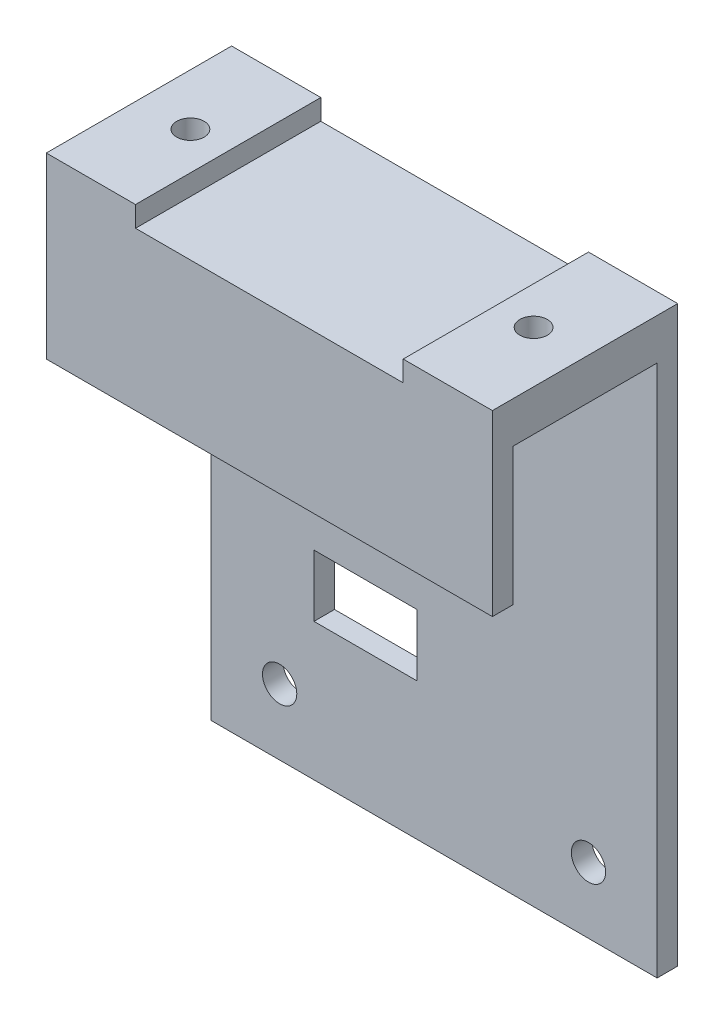
ISO-10303-21;
HEADER;
FILE_DESCRIPTION(('STEP AP214'),'2;1');
FILE_NAME('part.step','',(''),(''),'','','');
FILE_SCHEMA(('AUTOMOTIVE_DESIGN { 1 0 10303 214 1 1 1 1 }'));
ENDSEC;
DATA;
#1=APPLICATION_CONTEXT('core data for automotive mechanical design processes');
#2=APPLICATION_PROTOCOL_DEFINITION('international standard','automotive_design',2000,#1);
#3=PRODUCT_CONTEXT('',#1,'mechanical');
#4=PRODUCT('Part','Part','',(#3));
#5=PRODUCT_RELATED_PRODUCT_CATEGORY('part','',(#4));
#6=PRODUCT_DEFINITION_FORMATION('','',#4);
#7=PRODUCT_DEFINITION_CONTEXT('part definition',#1,'design');
#8=PRODUCT_DEFINITION('design','',#6,#7);
#9=PRODUCT_DEFINITION_SHAPE('','',#8);
#10=(LENGTH_UNIT() NAMED_UNIT(*) SI_UNIT(.MILLI.,.METRE.));
#11=(NAMED_UNIT(*) PLANE_ANGLE_UNIT() SI_UNIT($,.RADIAN.));
#12=(NAMED_UNIT(*) SI_UNIT($,.STERADIAN.) SOLID_ANGLE_UNIT());
#13=UNCERTAINTY_MEASURE_WITH_UNIT(LENGTH_MEASURE(1.E-05),#10,'distance_accuracy_value','');
#14=(GEOMETRIC_REPRESENTATION_CONTEXT(3) GLOBAL_UNCERTAINTY_ASSIGNED_CONTEXT((#13)) GLOBAL_UNIT_ASSIGNED_CONTEXT((#10,
#11,#12)) REPRESENTATION_CONTEXT('',''));
#15=CARTESIAN_POINT('',(0.,0.,0.));
#16=DIRECTION('',(0.,0.,1.));
#17=DIRECTION('',(1.,0.,0.));
#18=AXIS2_PLACEMENT_3D('',#15,#16,#17);
#19=CARTESIAN_POINT('',(-32.5,35.,3.));
#20=DIRECTION('',(0.,-1.,0.));
#21=DIRECTION('',(0.,0.,-1.));
#22=AXIS2_PLACEMENT_3D('',#19,#20,#21);
#23=PLANE('',#22);
#24=CARTESIAN_POINT('',(-25.,35.,13.5));
#25=DIRECTION('',(0.,1.,0.));
#26=DIRECTION('',(0.,0.,1.));
#27=AXIS2_PLACEMENT_3D('',#24,#25,#26);
#28=CIRCLE('',#27,2.);
#29=CARTESIAN_POINT('',(-25.,35.,15.5));
#30=VERTEX_POINT('',#29);
#31=EDGE_CURVE('E248',#30,#30,#28,.T.);
#32=ORIENTED_EDGE('',*,*,#31,.F.);
#33=EDGE_LOOP('',(#32));
#34=FACE_BOUND('',#33,.T.);
#35=DIRECTION('',(1.,0.,0.));
#36=VECTOR('',#35,1.);
#37=CARTESIAN_POINT('',(-32.5,35.,27.));
#38=LINE('',#37,#36);
#39=CARTESIAN_POINT('',(-32.5,35.,27.));
#40=VERTEX_POINT('',#39);
#41=CARTESIAN_POINT('',(-19.5,35.,27.));
#42=VERTEX_POINT('',#41);
#43=EDGE_CURVE('E298',#40,#42,#38,.T.);
#44=ORIENTED_EDGE('',*,*,#43,.T.);
#45=DIRECTION('',(0.,0.,1.));
#46=VECTOR('',#45,1.);
#47=CARTESIAN_POINT('',(-19.5,35.,0.));
#48=LINE('',#47,#46);
#49=CARTESIAN_POINT('',(-19.5,35.,0.));
#50=VERTEX_POINT('',#49);
#51=EDGE_CURVE('E279',#50,#42,#48,.T.);
#52=ORIENTED_EDGE('',*,*,#51,.F.);
#53=DIRECTION('',(-1.,0.,0.));
#54=VECTOR('',#53,1.);
#55=CARTESIAN_POINT('',(-32.5,35.,0.));
#56=LINE('',#55,#54);
#57=CARTESIAN_POINT('',(-32.5,35.,0.));
#58=VERTEX_POINT('',#57);
#59=EDGE_CURVE('E356',#50,#58,#56,.T.);
#60=ORIENTED_EDGE('',*,*,#59,.T.);
#61=DIRECTION('',(0.,0.,-1.));
#62=VECTOR('',#61,1.);
#63=CARTESIAN_POINT('',(-32.5,35.,3.));
#64=LINE('',#63,#62);
#65=EDGE_CURVE('E61',#40,#58,#64,.T.);
#66=ORIENTED_EDGE('',*,*,#65,.F.);
#67=EDGE_LOOP('',(#44,#52,#60,#66));
#68=FACE_BOUND('',#67,.T.);
#69=ADVANCED_FACE('F51',(#34,#68),#23,.F.);
#70=CARTESIAN_POINT('',(0.,0.,3.));
#71=DIRECTION('',(0.,0.,-1.));
#72=DIRECTION('',(-1.,0.,0.));
#73=AXIS2_PLACEMENT_3D('',#70,#71,#72);
#74=PLANE('',#73);
#75=DIRECTION('',(-1.,0.,0.));
#76=VECTOR('',#75,1.);
#77=CARTESIAN_POINT('',(-17.5,-19.6,3.));
#78=LINE('',#77,#76);
#79=CARTESIAN_POINT('',(-2.5,-19.6,3.));
#80=VERTEX_POINT('',#79);
#81=CARTESIAN_POINT('',(-17.5,-19.6,3.));
#82=VERTEX_POINT('',#81);
#83=EDGE_CURVE('E201',#80,#82,#78,.T.);
#84=ORIENTED_EDGE('',*,*,#83,.F.);
#85=DIRECTION('',(0.,1.,0.));
#86=VECTOR('',#85,1.);
#87=CARTESIAN_POINT('',(-2.5,-19.6,3.));
#88=LINE('',#87,#86);
#89=CARTESIAN_POINT('',(-2.5,-28.6,3.));
#90=VERTEX_POINT('',#89);
#91=EDGE_CURVE('E69',#90,#80,#88,.T.);
#92=ORIENTED_EDGE('',*,*,#91,.F.);
#93=DIRECTION('',(1.,0.,0.));
#94=VECTOR('',#93,1.);
#95=CARTESIAN_POINT('',(-17.5,-28.6,3.));
#96=LINE('',#95,#94);
#97=CARTESIAN_POINT('',(-17.5,-28.6,3.));
#98=VERTEX_POINT('',#97);
#99=EDGE_CURVE('E188',#98,#90,#96,.T.);
#100=ORIENTED_EDGE('',*,*,#99,.F.);
#101=DIRECTION('',(0.,-1.,0.));
#102=VECTOR('',#101,1.);
#103=CARTESIAN_POINT('',(-17.5,-19.6,3.));
#104=LINE('',#103,#102);
#105=EDGE_CURVE('E192',#82,#98,#104,.T.);
#106=ORIENTED_EDGE('',*,*,#105,.F.);
#107=EDGE_LOOP('',(#84,#92,#100,#106));
#108=FACE_BOUND('',#107,.T.);
#109=CARTESIAN_POINT('',(-22.5,-39.,3.));
#110=DIRECTION('',(0.,0.,1.));
#111=DIRECTION('',(1.,0.,0.));
#112=AXIS2_PLACEMENT_3D('',#109,#110,#111);
#113=CIRCLE('',#112,2.5);
#114=CARTESIAN_POINT('',(-20.,-39.,3.));
#115=VERTEX_POINT('',#114);
#116=EDGE_CURVE('E221',#115,#115,#113,.T.);
#117=ORIENTED_EDGE('',*,*,#116,.F.);
#118=EDGE_LOOP('',(#117));
#119=FACE_BOUND('',#118,.T.);
#120=CARTESIAN_POINT('',(22.5,-39.,3.));
#121=DIRECTION('',(0.,0.,1.));
#122=DIRECTION('',(1.,0.,0.));
#123=AXIS2_PLACEMENT_3D('',#120,#121,#122);
#124=CIRCLE('',#123,2.5);
#125=CARTESIAN_POINT('',(25.,-39.,3.));
#126=VERTEX_POINT('',#125);
#127=EDGE_CURVE('E225',#126,#126,#124,.T.);
#128=ORIENTED_EDGE('',*,*,#127,.F.);
#129=EDGE_LOOP('',(#128));
#130=FACE_BOUND('',#129,.T.);
#131=DIRECTION('',(1.,0.,0.));
#132=VECTOR('',#131,1.);
#133=CARTESIAN_POINT('',(-32.5,29.,3.));
#134=LINE('',#133,#132);
#135=CARTESIAN_POINT('',(-32.5,29.,3.));
#136=VERTEX_POINT('',#135);
#137=CARTESIAN_POINT('',(32.5,29.,3.));
#138=VERTEX_POINT('',#137);
#139=EDGE_CURVE('E318',#136,#138,#134,.T.);
#140=ORIENTED_EDGE('',*,*,#139,.F.);
#141=DIRECTION('',(0.,-1.,0.));
#142=VECTOR('',#141,1.);
#143=CARTESIAN_POINT('',(-32.5,-35.,3.));
#144=LINE('',#143,#142);
#145=CARTESIAN_POINT('',(-32.5,-48.6,3.));
#146=VERTEX_POINT('',#145);
#147=EDGE_CURVE('E349',#136,#146,#144,.T.);
#148=ORIENTED_EDGE('',*,*,#147,.T.);
#149=DIRECTION('',(-1.,0.,0.));
#150=VECTOR('',#149,1.);
#151=CARTESIAN_POINT('',(32.5,-48.6,3.));
#152=LINE('',#151,#150);
#153=CARTESIAN_POINT('',(32.5,-48.6,3.));
#154=VERTEX_POINT('',#153);
#155=EDGE_CURVE('E243',#154,#146,#152,.T.);
#156=ORIENTED_EDGE('',*,*,#155,.F.);
#157=DIRECTION('',(0.,1.,0.));
#158=VECTOR('',#157,1.);
#159=CARTESIAN_POINT('',(32.5,-35.,3.));
#160=LINE('',#159,#158);
#161=EDGE_CURVE('E346',#154,#138,#160,.T.);
#162=ORIENTED_EDGE('',*,*,#161,.T.);
#163=EDGE_LOOP('',(#140,#148,#156,#162));
#164=FACE_BOUND('',#163,.T.);
#165=ADVANCED_FACE('F392',(#108,#119,#130,#164),#74,.F.);
#166=CARTESIAN_POINT('',(32.5,-35.,3.));
#167=DIRECTION('',(-1.,0.,0.));
#168=DIRECTION('',(0.,0.,1.));
#169=AXIS2_PLACEMENT_3D('',#166,#167,#168);
#170=PLANE('',#169);
#171=DIRECTION('',(0.,1.,0.));
#172=VECTOR('',#171,1.);
#173=CARTESIAN_POINT('',(32.5,-35.,0.));
#174=LINE('',#173,#172);
#175=CARTESIAN_POINT('',(32.5,-48.6,0.));
#176=VERTEX_POINT('',#175);
#177=CARTESIAN_POINT('',(32.5,35.,0.));
#178=VERTEX_POINT('',#177);
#179=EDGE_CURVE('E345',#176,#178,#174,.T.);
#180=ORIENTED_EDGE('',*,*,#179,.T.);
#181=DIRECTION('',(0.,0.,-1.));
#182=VECTOR('',#181,1.);
#183=CARTESIAN_POINT('',(32.5,35.,3.));
#184=LINE('',#183,#182);
#185=CARTESIAN_POINT('',(32.5,35.,27.));
#186=VERTEX_POINT('',#185);
#187=EDGE_CURVE('E12',#186,#178,#184,.T.);
#188=ORIENTED_EDGE('',*,*,#187,.F.);
#189=DIRECTION('',(0.,1.,0.));
#190=VECTOR('',#189,1.);
#191=CARTESIAN_POINT('',(32.5,9.00000000000001,27.));
#192=LINE('',#191,#190);
#193=CARTESIAN_POINT('',(32.5,9.00000000000001,27.));
#194=VERTEX_POINT('',#193);
#195=EDGE_CURVE('E323',#194,#186,#192,.T.);
#196=ORIENTED_EDGE('',*,*,#195,.F.);
#197=DIRECTION('',(0.,0.,-1.));
#198=VECTOR('',#197,1.);
#199=CARTESIAN_POINT('',(32.5,9.00000000000001,24.));
#200=LINE('',#199,#198);
#201=CARTESIAN_POINT('',(32.5,9.00000000000001,24.));
#202=VERTEX_POINT('',#201);
#203=EDGE_CURVE('E302',#194,#202,#200,.T.);
#204=ORIENTED_EDGE('',*,*,#203,.T.);
#205=DIRECTION('',(0.,1.,0.));
#206=VECTOR('',#205,1.);
#207=CARTESIAN_POINT('',(32.5,9.00000000000001,24.));
#208=LINE('',#207,#206);
#209=CARTESIAN_POINT('',(32.5,29.,24.));
#210=VERTEX_POINT('',#209);
#211=EDGE_CURVE('E319',#202,#210,#208,.T.);
#212=ORIENTED_EDGE('',*,*,#211,.T.);
#213=DIRECTION('',(0.,0.,-1.));
#214=VECTOR('',#213,1.);
#215=CARTESIAN_POINT('',(32.5,29.,24.));
#216=LINE('',#215,#214);
#217=EDGE_CURVE('E334',#210,#138,#216,.T.);
#218=ORIENTED_EDGE('',*,*,#217,.T.);
#219=ORIENTED_EDGE('',*,*,#161,.F.);
#220=DIRECTION('',(0.,0.,1.));
#221=VECTOR('',#220,1.);
#222=CARTESIAN_POINT('',(32.5,-48.6,0.));
#223=LINE('',#222,#221);
#224=EDGE_CURVE('E239',#176,#154,#223,.T.);
#225=ORIENTED_EDGE('',*,*,#224,.F.);
#226=EDGE_LOOP('',(#180,#188,#196,#204,#212,#218,#219,#225));
#227=FACE_BOUND('',#226,.T.);
#228=ADVANCED_FACE('F53',(#227),#170,.F.);
#229=CARTESIAN_POINT('',(25.,35.,13.5));
#230=DIRECTION('',(0.,1.,0.));
#231=DIRECTION('',(0.,0.,1.));
#232=AXIS2_PLACEMENT_3D('',#229,#230,#231);
#233=CIRCLE('',#232,2.);
#234=CARTESIAN_POINT('',(25.,35.,15.5));
#235=VERTEX_POINT('',#234);
#236=EDGE_CURVE('E247',#235,#235,#233,.T.);
#237=ORIENTED_EDGE('',*,*,#236,.F.);
#238=EDGE_LOOP('',(#237));
#239=FACE_BOUND('',#238,.T.);
#240=CARTESIAN_POINT('',(19.5,35.,0.));
#241=VERTEX_POINT('',#240);
#242=EDGE_CURVE('E357',#178,#241,#56,.T.);
#243=ORIENTED_EDGE('',*,*,#242,.T.);
#244=DIRECTION('',(0.,0.,1.));
#245=VECTOR('',#244,1.);
#246=CARTESIAN_POINT('',(19.5,35.,0.));
#247=LINE('',#246,#245);
#248=CARTESIAN_POINT('',(19.5,35.,27.));
#249=VERTEX_POINT('',#248);
#250=EDGE_CURVE('E283',#241,#249,#247,.T.);
#251=ORIENTED_EDGE('',*,*,#250,.T.);
#252=EDGE_CURVE('E282',#249,#186,#38,.T.);
#253=ORIENTED_EDGE('',*,*,#252,.T.);
#254=ORIENTED_EDGE('',*,*,#187,.T.);
#255=EDGE_LOOP('',(#243,#251,#253,#254));
#256=FACE_BOUND('',#255,.T.);
#257=ADVANCED_FACE('F394',(#239,#256),#23,.F.);
#258=CARTESIAN_POINT('',(-32.5,-35.,3.));
#259=DIRECTION('',(1.,0.,0.));
#260=DIRECTION('',(0.,0.,-1.));
#261=AXIS2_PLACEMENT_3D('',#258,#259,#260);
#262=PLANE('',#261);
#263=DIRECTION('',(0.,-1.,0.));
#264=VECTOR('',#263,1.);
#265=CARTESIAN_POINT('',(-32.5,-35.,0.));
#266=LINE('',#265,#264);
#267=CARTESIAN_POINT('',(-32.5,-48.6,0.));
#268=VERTEX_POINT('',#267);
#269=EDGE_CURVE('E350',#58,#268,#266,.T.);
#270=ORIENTED_EDGE('',*,*,#269,.T.);
#271=DIRECTION('',(0.,0.,-1.));
#272=VECTOR('',#271,1.);
#273=CARTESIAN_POINT('',(-32.5,-48.6,3.));
#274=LINE('',#273,#272);
#275=EDGE_CURVE('E220',#146,#268,#274,.T.);
#276=ORIENTED_EDGE('',*,*,#275,.F.);
#277=ORIENTED_EDGE('',*,*,#147,.F.);
#278=DIRECTION('',(0.,0.,-1.));
#279=VECTOR('',#278,1.);
#280=CARTESIAN_POINT('',(-32.5,29.,24.));
#281=LINE('',#280,#279);
#282=CARTESIAN_POINT('',(-32.5,29.,24.));
#283=VERTEX_POINT('',#282);
#284=EDGE_CURVE('E341',#283,#136,#281,.T.);
#285=ORIENTED_EDGE('',*,*,#284,.F.);
#286=DIRECTION('',(0.,1.,0.));
#287=VECTOR('',#286,1.);
#288=CARTESIAN_POINT('',(-32.5,9.00000000000001,24.));
#289=LINE('',#288,#287);
#290=CARTESIAN_POINT('',(-32.5,9.00000000000001,24.));
#291=VERTEX_POINT('',#290);
#292=EDGE_CURVE('E314',#291,#283,#289,.T.);
#293=ORIENTED_EDGE('',*,*,#292,.F.);
#294=DIRECTION('',(0.,0.,1.));
#295=VECTOR('',#294,1.);
#296=CARTESIAN_POINT('',(-32.5,9.00000000000001,24.));
#297=LINE('',#296,#295);
#298=CARTESIAN_POINT('',(-32.5,9.00000000000001,27.));
#299=VERTEX_POINT('',#298);
#300=EDGE_CURVE('E293',#291,#299,#297,.T.);
#301=ORIENTED_EDGE('',*,*,#300,.T.);
#302=DIRECTION('',(0.,1.,0.));
#303=VECTOR('',#302,1.);
#304=CARTESIAN_POINT('',(-32.5,9.00000000000001,27.));
#305=LINE('',#304,#303);
#306=EDGE_CURVE('E310',#299,#40,#305,.T.);
#307=ORIENTED_EDGE('',*,*,#306,.T.);
#308=ORIENTED_EDGE('',*,*,#65,.T.);
#309=EDGE_LOOP('',(#270,#276,#277,#285,#293,#301,#307,#308));
#310=FACE_BOUND('',#309,.T.);
#311=ADVANCED_FACE('F404',(#310),#262,.F.);
#312=CARTESIAN_POINT('',(0.,0.,0.));
#313=DIRECTION('',(0.,0.,-1.));
#314=DIRECTION('',(-1.,0.,0.));
#315=AXIS2_PLACEMENT_3D('',#312,#313,#314);
#316=PLANE('',#315);
#317=DIRECTION('',(0.,1.,0.));
#318=VECTOR('',#317,1.);
#319=CARTESIAN_POINT('',(-2.5,-19.6,0.));
#320=LINE('',#319,#318);
#321=CARTESIAN_POINT('',(-2.5,-28.6,0.));
#322=VERTEX_POINT('',#321);
#323=CARTESIAN_POINT('',(-2.5,-19.6,0.));
#324=VERTEX_POINT('',#323);
#325=EDGE_CURVE('E169',#322,#324,#320,.T.);
#326=ORIENTED_EDGE('',*,*,#325,.T.);
#327=DIRECTION('',(-1.,0.,0.));
#328=VECTOR('',#327,1.);
#329=CARTESIAN_POINT('',(-17.5,-19.6,0.));
#330=LINE('',#329,#328);
#331=CARTESIAN_POINT('',(-17.5,-19.6,0.));
#332=VERTEX_POINT('',#331);
#333=EDGE_CURVE('E179',#324,#332,#330,.T.);
#334=ORIENTED_EDGE('',*,*,#333,.T.);
#335=DIRECTION('',(0.,-1.,0.));
#336=VECTOR('',#335,1.);
#337=CARTESIAN_POINT('',(-17.5,-19.6,0.));
#338=LINE('',#337,#336);
#339=CARTESIAN_POINT('',(-17.5,-28.6,0.));
#340=VERTEX_POINT('',#339);
#341=EDGE_CURVE('E77',#332,#340,#338,.T.);
#342=ORIENTED_EDGE('',*,*,#341,.T.);
#343=DIRECTION('',(1.,0.,0.));
#344=VECTOR('',#343,1.);
#345=CARTESIAN_POINT('',(-17.5,-28.6,0.));
#346=LINE('',#345,#344);
#347=EDGE_CURVE('E176',#340,#322,#346,.T.);
#348=ORIENTED_EDGE('',*,*,#347,.T.);
#349=EDGE_LOOP('',(#326,#334,#342,#348));
#350=FACE_BOUND('',#349,.T.);
#351=CARTESIAN_POINT('',(-22.5,-39.,0.));
#352=DIRECTION('',(0.,0.,1.));
#353=DIRECTION('',(1.,0.,0.));
#354=AXIS2_PLACEMENT_3D('',#351,#352,#353);
#355=CIRCLE('',#354,2.5);
#356=CARTESIAN_POINT('',(-20.,-39.,0.));
#357=VERTEX_POINT('',#356);
#358=EDGE_CURVE('E216',#357,#357,#355,.T.);
#359=ORIENTED_EDGE('',*,*,#358,.T.);
#360=EDGE_LOOP('',(#359));
#361=FACE_BOUND('',#360,.T.);
#362=CARTESIAN_POINT('',(22.5,-39.,0.));
#363=DIRECTION('',(0.,0.,1.));
#364=DIRECTION('',(1.,0.,0.));
#365=AXIS2_PLACEMENT_3D('',#362,#363,#364);
#366=CIRCLE('',#365,2.5);
#367=CARTESIAN_POINT('',(25.,-39.,0.));
#368=VERTEX_POINT('',#367);
#369=EDGE_CURVE('E210',#368,#368,#366,.T.);
#370=ORIENTED_EDGE('',*,*,#369,.T.);
#371=EDGE_LOOP('',(#370));
#372=FACE_BOUND('',#371,.T.);
#373=DIRECTION('',(0.,-1.,0.));
#374=VECTOR('',#373,1.);
#375=CARTESIAN_POINT('',(-19.5,35.,0.));
#376=LINE('',#375,#374);
#377=CARTESIAN_POINT('',(-19.5,32.,0.));
#378=VERTEX_POINT('',#377);
#379=EDGE_CURVE('E256',#50,#378,#376,.T.);
#380=ORIENTED_EDGE('',*,*,#379,.T.);
#381=DIRECTION('',(1.,0.,0.));
#382=VECTOR('',#381,1.);
#383=CARTESIAN_POINT('',(-19.5,32.,0.));
#384=LINE('',#383,#382);
#385=CARTESIAN_POINT('',(19.5,32.,0.));
#386=VERTEX_POINT('',#385);
#387=EDGE_CURVE('E260',#378,#386,#384,.T.);
#388=ORIENTED_EDGE('',*,*,#387,.T.);
#389=DIRECTION('',(0.,1.,0.));
#390=VECTOR('',#389,1.);
#391=CARTESIAN_POINT('',(19.5,35.,0.));
#392=LINE('',#391,#390);
#393=EDGE_CURVE('E265',#386,#241,#392,.T.);
#394=ORIENTED_EDGE('',*,*,#393,.T.);
#395=ORIENTED_EDGE('',*,*,#242,.F.);
#396=ORIENTED_EDGE('',*,*,#179,.F.);
#397=DIRECTION('',(1.,0.,0.));
#398=VECTOR('',#397,1.);
#399=CARTESIAN_POINT('',(-32.5,-48.6,0.));
#400=LINE('',#399,#398);
#401=EDGE_CURVE('E235',#268,#176,#400,.T.);
#402=ORIENTED_EDGE('',*,*,#401,.F.);
#403=ORIENTED_EDGE('',*,*,#269,.F.);
#404=ORIENTED_EDGE('',*,*,#59,.F.);
#405=EDGE_LOOP('',(#380,#388,#394,#395,#396,#402,#403,#404));
#406=FACE_BOUND('',#405,.T.);
#407=ADVANCED_FACE('F184',(#350,#361,#372,#406),#316,.T.);
#408=CARTESIAN_POINT('',(-32.5,29.,24.));
#409=DIRECTION('',(0.,1.,0.));
#410=DIRECTION('',(-1.,0.,0.));
#411=AXIS2_PLACEMENT_3D('',#408,#409,#410);
#412=PLANE('',#411);
#413=CARTESIAN_POINT('',(-25.,29.,13.5));
#414=DIRECTION('',(0.,1.,0.));
#415=DIRECTION('',(-1.,0.,0.));
#416=AXIS2_PLACEMENT_3D('',#413,#414,#415);
#417=CIRCLE('',#416,2.);
#418=CARTESIAN_POINT('',(-27.,29.,13.5));
#419=VERTEX_POINT('',#418);
#420=EDGE_CURVE('E55',#419,#419,#417,.T.);
#421=ORIENTED_EDGE('',*,*,#420,.T.);
#422=EDGE_LOOP('',(#421));
#423=FACE_BOUND('',#422,.T.);
#424=CARTESIAN_POINT('',(25.,29.,13.5));
#425=DIRECTION('',(0.,1.,0.));
#426=DIRECTION('',(-1.,0.,0.));
#427=AXIS2_PLACEMENT_3D('',#424,#425,#426);
#428=CIRCLE('',#427,2.);
#429=CARTESIAN_POINT('',(23.,29.,13.5));
#430=VERTEX_POINT('',#429);
#431=EDGE_CURVE('E252',#430,#430,#428,.T.);
#432=ORIENTED_EDGE('',*,*,#431,.T.);
#433=EDGE_LOOP('',(#432));
#434=FACE_BOUND('',#433,.T.);
#435=ORIENTED_EDGE('',*,*,#139,.T.);
#436=ORIENTED_EDGE('',*,*,#217,.F.);
#437=DIRECTION('',(1.,0.,0.));
#438=VECTOR('',#437,1.);
#439=CARTESIAN_POINT('',(-32.5,29.,24.));
#440=LINE('',#439,#438);
#441=EDGE_CURVE('E330',#283,#210,#440,.T.);
#442=ORIENTED_EDGE('',*,*,#441,.F.);
#443=ORIENTED_EDGE('',*,*,#284,.T.);
#444=EDGE_LOOP('',(#435,#436,#442,#443));
#445=FACE_BOUND('',#444,.T.);
#446=ADVANCED_FACE('F373',(#423,#434,#445),#412,.F.);
#447=CARTESIAN_POINT('',(-32.5,9.00000000000001,24.));
#448=DIRECTION('',(0.,0.,-1.));
#449=DIRECTION('',(-1.,0.,0.));
#450=AXIS2_PLACEMENT_3D('',#447,#448,#449);
#451=PLANE('',#450);
#452=ORIENTED_EDGE('',*,*,#292,.T.);
#453=ORIENTED_EDGE('',*,*,#441,.T.);
#454=ORIENTED_EDGE('',*,*,#211,.F.);
#455=DIRECTION('',(-1.,0.,0.));
#456=VECTOR('',#455,1.);
#457=CARTESIAN_POINT('',(-32.5,9.00000000000001,24.));
#458=LINE('',#457,#456);
#459=EDGE_CURVE('E306',#202,#291,#458,.T.);
#460=ORIENTED_EDGE('',*,*,#459,.T.);
#461=EDGE_LOOP('',(#452,#453,#454,#460));
#462=FACE_BOUND('',#461,.T.);
#463=ADVANCED_FACE('F441',(#462),#451,.T.);
#464=CARTESIAN_POINT('',(-32.5,9.00000000000001,27.));
#465=DIRECTION('',(0.,0.,1.));
#466=DIRECTION('',(1.,0.,0.));
#467=AXIS2_PLACEMENT_3D('',#464,#465,#466);
#468=PLANE('',#467);
#469=DIRECTION('',(0.,-1.,0.));
#470=VECTOR('',#469,1.);
#471=CARTESIAN_POINT('',(-19.5,35.,27.));
#472=LINE('',#471,#470);
#473=CARTESIAN_POINT('',(-19.5,32.,27.));
#474=VERTEX_POINT('',#473);
#475=EDGE_CURVE('E270',#42,#474,#472,.T.);
#476=ORIENTED_EDGE('',*,*,#475,.F.);
#477=ORIENTED_EDGE('',*,*,#43,.F.);
#478=ORIENTED_EDGE('',*,*,#306,.F.);
#479=DIRECTION('',(1.,0.,0.));
#480=VECTOR('',#479,1.);
#481=CARTESIAN_POINT('',(-32.5,9.00000000000001,27.));
#482=LINE('',#481,#480);
#483=EDGE_CURVE('E297',#299,#194,#482,.T.);
#484=ORIENTED_EDGE('',*,*,#483,.T.);
#485=ORIENTED_EDGE('',*,*,#195,.T.);
#486=ORIENTED_EDGE('',*,*,#252,.F.);
#487=DIRECTION('',(0.,1.,0.));
#488=VECTOR('',#487,1.);
#489=CARTESIAN_POINT('',(19.5,35.,27.));
#490=LINE('',#489,#488);
#491=CARTESIAN_POINT('',(19.5,32.,27.));
#492=VERTEX_POINT('',#491);
#493=EDGE_CURVE('E261',#492,#249,#490,.T.);
#494=ORIENTED_EDGE('',*,*,#493,.F.);
#495=DIRECTION('',(1.,0.,0.));
#496=VECTOR('',#495,1.);
#497=CARTESIAN_POINT('',(-19.5,32.,27.));
#498=LINE('',#497,#496);
#499=EDGE_CURVE('E273',#474,#492,#498,.T.);
#500=ORIENTED_EDGE('',*,*,#499,.F.);
#501=EDGE_LOOP('',(#476,#477,#478,#484,#485,#486,#494,#500));
#502=FACE_BOUND('',#501,.T.);
#503=ADVANCED_FACE('F426',(#502),#468,.T.);
#504=CARTESIAN_POINT('',(0.,9.00000000000001,0.));
#505=DIRECTION('',(0.,1.,0.));
#506=DIRECTION('',(0.,0.,1.));
#507=AXIS2_PLACEMENT_3D('',#504,#505,#506);
#508=PLANE('',#507);
#509=ORIENTED_EDGE('',*,*,#300,.F.);
#510=ORIENTED_EDGE('',*,*,#459,.F.);
#511=ORIENTED_EDGE('',*,*,#203,.F.);
#512=ORIENTED_EDGE('',*,*,#483,.F.);
#513=EDGE_LOOP('',(#509,#510,#511,#512));
#514=FACE_BOUND('',#513,.T.);
#515=ADVANCED_FACE('F447',(#514),#508,.F.);
#516=CARTESIAN_POINT('',(-19.5,35.,0.));
#517=DIRECTION('',(-1.,0.,0.));
#518=DIRECTION('',(0.,0.,1.));
#519=AXIS2_PLACEMENT_3D('',#516,#517,#518);
#520=PLANE('',#519);
#521=ORIENTED_EDGE('',*,*,#475,.T.);
#522=DIRECTION('',(0.,0.,1.));
#523=VECTOR('',#522,1.);
#524=CARTESIAN_POINT('',(-19.5,32.,0.));
#525=LINE('',#524,#523);
#526=EDGE_CURVE('E269',#378,#474,#525,.T.);
#527=ORIENTED_EDGE('',*,*,#526,.F.);
#528=ORIENTED_EDGE('',*,*,#379,.F.);
#529=ORIENTED_EDGE('',*,*,#51,.T.);
#530=EDGE_LOOP('',(#521,#527,#528,#529));
#531=FACE_BOUND('',#530,.T.);
#532=ADVANCED_FACE('F449',(#531),#520,.F.);
#533=CARTESIAN_POINT('',(19.5,35.,0.));
#534=DIRECTION('',(1.,0.,0.));
#535=DIRECTION('',(0.,0.,-1.));
#536=AXIS2_PLACEMENT_3D('',#533,#534,#535);
#537=PLANE('',#536);
#538=ORIENTED_EDGE('',*,*,#493,.T.);
#539=ORIENTED_EDGE('',*,*,#250,.F.);
#540=ORIENTED_EDGE('',*,*,#393,.F.);
#541=DIRECTION('',(0.,0.,1.));
#542=VECTOR('',#541,1.);
#543=CARTESIAN_POINT('',(19.5,32.,0.));
#544=LINE('',#543,#542);
#545=EDGE_CURVE('E287',#386,#492,#544,.T.);
#546=ORIENTED_EDGE('',*,*,#545,.T.);
#547=EDGE_LOOP('',(#538,#539,#540,#546));
#548=FACE_BOUND('',#547,.T.);
#549=ADVANCED_FACE('F421',(#548),#537,.F.);
#550=CARTESIAN_POINT('',(-19.5,32.,0.));
#551=DIRECTION('',(0.,-1.,0.));
#552=DIRECTION('',(0.,0.,-1.));
#553=AXIS2_PLACEMENT_3D('',#550,#551,#552);
#554=PLANE('',#553);
#555=ORIENTED_EDGE('',*,*,#499,.T.);
#556=ORIENTED_EDGE('',*,*,#545,.F.);
#557=ORIENTED_EDGE('',*,*,#387,.F.);
#558=ORIENTED_EDGE('',*,*,#526,.T.);
#559=EDGE_LOOP('',(#555,#556,#557,#558));
#560=FACE_BOUND('',#559,.T.);
#561=ADVANCED_FACE('F388',(#560),#554,.F.);
#562=CARTESIAN_POINT('',(25.,-35.,13.5));
#563=DIRECTION('',(0.,1.,0.));
#564=DIRECTION('',(0.,0.,1.));
#565=AXIS2_PLACEMENT_3D('',#562,#563,#564);
#566=CYLINDRICAL_SURFACE('',#565,2.);
#567=ORIENTED_EDGE('',*,*,#236,.T.);
#568=EDGE_LOOP('',(#567));
#569=FACE_BOUND('',#568,.T.);
#570=ORIENTED_EDGE('',*,*,#431,.F.);
#571=EDGE_LOOP('',(#570));
#572=FACE_BOUND('',#571,.T.);
#573=ADVANCED_FACE('F378',(#569,#572),#566,.F.);
#574=CARTESIAN_POINT('',(-25.,-35.,13.5));
#575=DIRECTION('',(0.,1.,0.));
#576=DIRECTION('',(0.,0.,1.));
#577=AXIS2_PLACEMENT_3D('',#574,#575,#576);
#578=CYLINDRICAL_SURFACE('',#577,2.);
#579=ORIENTED_EDGE('',*,*,#31,.T.);
#580=EDGE_LOOP('',(#579));
#581=FACE_BOUND('',#580,.T.);
#582=ORIENTED_EDGE('',*,*,#420,.F.);
#583=EDGE_LOOP('',(#582));
#584=FACE_BOUND('',#583,.T.);
#585=ADVANCED_FACE('F375',(#581,#584),#578,.F.);
#586=CARTESIAN_POINT('',(0.,-48.6,0.));
#587=DIRECTION('',(0.,-1.,0.));
#588=DIRECTION('',(0.,0.,-1.));
#589=AXIS2_PLACEMENT_3D('',#586,#587,#588);
#590=PLANE('',#589);
#591=ORIENTED_EDGE('',*,*,#275,.T.);
#592=ORIENTED_EDGE('',*,*,#401,.T.);
#593=ORIENTED_EDGE('',*,*,#224,.T.);
#594=ORIENTED_EDGE('',*,*,#155,.T.);
#595=EDGE_LOOP('',(#591,#592,#593,#594));
#596=FACE_BOUND('',#595,.T.);
#597=ADVANCED_FACE('F377',(#596),#590,.T.);
#598=CARTESIAN_POINT('',(22.5,-39.,0.));
#599=DIRECTION('',(0.,0.,1.));
#600=DIRECTION('',(1.,0.,0.));
#601=AXIS2_PLACEMENT_3D('',#598,#599,#600);
#602=CYLINDRICAL_SURFACE('',#601,2.5);
#603=ORIENTED_EDGE('',*,*,#369,.F.);
#604=EDGE_LOOP('',(#603));
#605=FACE_BOUND('',#604,.T.);
#606=ORIENTED_EDGE('',*,*,#127,.T.);
#607=EDGE_LOOP('',(#606));
#608=FACE_BOUND('',#607,.T.);
#609=ADVANCED_FACE('F385',(#605,#608),#602,.F.);
#610=CARTESIAN_POINT('',(-22.5,-39.,0.));
#611=DIRECTION('',(0.,0.,1.));
#612=DIRECTION('',(1.,0.,0.));
#613=AXIS2_PLACEMENT_3D('',#610,#611,#612);
#614=CYLINDRICAL_SURFACE('',#613,2.5);
#615=ORIENTED_EDGE('',*,*,#358,.F.);
#616=EDGE_LOOP('',(#615));
#617=FACE_BOUND('',#616,.T.);
#618=ORIENTED_EDGE('',*,*,#116,.T.);
#619=EDGE_LOOP('',(#618));
#620=FACE_BOUND('',#619,.T.);
#621=ADVANCED_FACE('F570',(#617,#620),#614,.F.);
#622=CARTESIAN_POINT('',(-2.5,-19.6,0.));
#623=DIRECTION('',(1.,0.,0.));
#624=DIRECTION('',(0.,0.,-1.));
#625=AXIS2_PLACEMENT_3D('',#622,#623,#624);
#626=PLANE('',#625);
#627=ORIENTED_EDGE('',*,*,#91,.T.);
#628=DIRECTION('',(0.,0.,1.));
#629=VECTOR('',#628,1.);
#630=CARTESIAN_POINT('',(-2.5,-19.6,0.));
#631=LINE('',#630,#629);
#632=EDGE_CURVE('E165',#324,#80,#631,.T.);
#633=ORIENTED_EDGE('',*,*,#632,.F.);
#634=ORIENTED_EDGE('',*,*,#325,.F.);
#635=DIRECTION('',(0.,0.,1.));
#636=VECTOR('',#635,1.);
#637=CARTESIAN_POINT('',(-2.5,-28.6,0.));
#638=LINE('',#637,#636);
#639=EDGE_CURVE('E207',#322,#90,#638,.T.);
#640=ORIENTED_EDGE('',*,*,#639,.T.);
#641=EDGE_LOOP('',(#627,#633,#634,#640));
#642=FACE_BOUND('',#641,.T.);
#643=ADVANCED_FACE('F167',(#642),#626,.F.);
#644=CARTESIAN_POINT('',(-17.5,-28.6,0.));
#645=DIRECTION('',(0.,-1.,0.));
#646=DIRECTION('',(0.,0.,-1.));
#647=AXIS2_PLACEMENT_3D('',#644,#645,#646);
#648=PLANE('',#647);
#649=ORIENTED_EDGE('',*,*,#99,.T.);
#650=ORIENTED_EDGE('',*,*,#639,.F.);
#651=ORIENTED_EDGE('',*,*,#347,.F.);
#652=DIRECTION('',(0.,0.,1.));
#653=VECTOR('',#652,1.);
#654=CARTESIAN_POINT('',(-17.5,-28.6,0.));
#655=LINE('',#654,#653);
#656=EDGE_CURVE('E211',#340,#98,#655,.T.);
#657=ORIENTED_EDGE('',*,*,#656,.T.);
#658=EDGE_LOOP('',(#649,#650,#651,#657));
#659=FACE_BOUND('',#658,.T.);
#660=ADVANCED_FACE('F592',(#659),#648,.F.);
#661=CARTESIAN_POINT('',(-17.5,-19.6,0.));
#662=DIRECTION('',(-1.,0.,0.));
#663=DIRECTION('',(0.,0.,1.));
#664=AXIS2_PLACEMENT_3D('',#661,#662,#663);
#665=PLANE('',#664);
#666=ORIENTED_EDGE('',*,*,#105,.T.);
#667=ORIENTED_EDGE('',*,*,#656,.F.);
#668=ORIENTED_EDGE('',*,*,#341,.F.);
#669=DIRECTION('',(0.,0.,1.));
#670=VECTOR('',#669,1.);
#671=CARTESIAN_POINT('',(-17.5,-19.6,0.));
#672=LINE('',#671,#670);
#673=EDGE_CURVE('E175',#332,#82,#672,.T.);
#674=ORIENTED_EDGE('',*,*,#673,.T.);
#675=EDGE_LOOP('',(#666,#667,#668,#674));
#676=FACE_BOUND('',#675,.T.);
#677=ADVANCED_FACE('F600',(#676),#665,.F.);
#678=CARTESIAN_POINT('',(-17.5,-19.6,0.));
#679=DIRECTION('',(0.,1.,0.));
#680=DIRECTION('',(0.,0.,1.));
#681=AXIS2_PLACEMENT_3D('',#678,#679,#680);
#682=PLANE('',#681);
#683=ORIENTED_EDGE('',*,*,#83,.T.);
#684=ORIENTED_EDGE('',*,*,#673,.F.);
#685=ORIENTED_EDGE('',*,*,#333,.F.);
#686=ORIENTED_EDGE('',*,*,#632,.T.);
#687=EDGE_LOOP('',(#683,#684,#685,#686));
#688=FACE_BOUND('',#687,.T.);
#689=ADVANCED_FACE('F180',(#688),#682,.F.);
#690=CLOSED_SHELL('',(#69,#165,#228,#257,#311,#407,#446,#463,#503,#515,#532,#549,#561,#573,#585,
#597,#609,#621,#643,#660,#677,#689));
#691=MANIFOLD_SOLID_BREP('B2',#690);
#692=ADVANCED_BREP_SHAPE_REPRESENTATION('',(#18,#691),#14);
#693=SHAPE_DEFINITION_REPRESENTATION(#9,#692);
ENDSEC;
END-ISO-10303-21;
